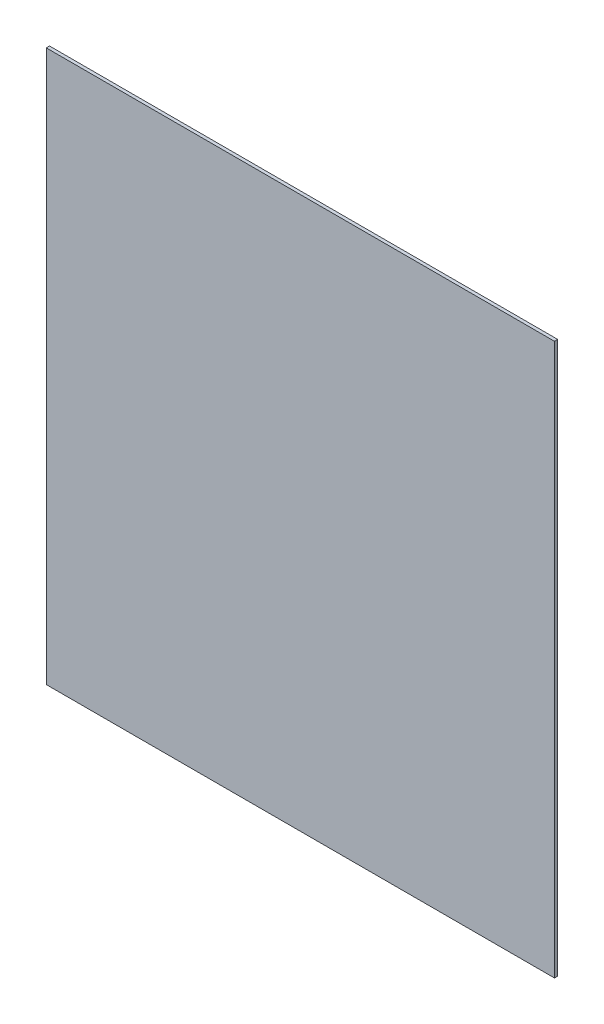
ISO-10303-21;
HEADER;
FILE_DESCRIPTION(('STEP AP214'),'2;1');
FILE_NAME('part.step','',(''),(''),'','','');
FILE_SCHEMA(('AUTOMOTIVE_DESIGN { 1 0 10303 214 1 1 1 1 }'));
ENDSEC;
DATA;
#1=APPLICATION_CONTEXT('core data for automotive mechanical design processes');
#2=APPLICATION_PROTOCOL_DEFINITION('international standard','automotive_design',2000,#1);
#3=PRODUCT_CONTEXT('',#1,'mechanical');
#4=PRODUCT('Part','Part','',(#3));
#5=PRODUCT_RELATED_PRODUCT_CATEGORY('part','',(#4));
#6=PRODUCT_DEFINITION_FORMATION('','',#4);
#7=PRODUCT_DEFINITION_CONTEXT('part definition',#1,'design');
#8=PRODUCT_DEFINITION('design','',#6,#7);
#9=PRODUCT_DEFINITION_SHAPE('','',#8);
#10=(LENGTH_UNIT() NAMED_UNIT(*) SI_UNIT(.MILLI.,.METRE.));
#11=(NAMED_UNIT(*) PLANE_ANGLE_UNIT() SI_UNIT($,.RADIAN.));
#12=(NAMED_UNIT(*) SI_UNIT($,.STERADIAN.) SOLID_ANGLE_UNIT());
#13=UNCERTAINTY_MEASURE_WITH_UNIT(LENGTH_MEASURE(1.E-05),#10,'distance_accuracy_value','');
#14=(GEOMETRIC_REPRESENTATION_CONTEXT(3) GLOBAL_UNCERTAINTY_ASSIGNED_CONTEXT((#13)) GLOBAL_UNIT_ASSIGNED_CONTEXT((#10,
#11,#12)) REPRESENTATION_CONTEXT('',''));
#15=CARTESIAN_POINT('',(0.,0.,0.));
#16=DIRECTION('',(0.,0.,1.));
#17=DIRECTION('',(1.,0.,0.));
#18=AXIS2_PLACEMENT_3D('',#15,#16,#17);
#19=CARTESIAN_POINT('',(-235.,255.,3.));
#20=DIRECTION('',(1.,0.,0.));
#21=DIRECTION('',(0.,1.,0.));
#22=AXIS2_PLACEMENT_3D('',#19,#20,#21);
#23=PLANE('',#22);
#24=DIRECTION('',(0.,-1.,0.));
#25=VECTOR('',#24,1.);
#26=CARTESIAN_POINT('',(-235.,255.,0.));
#27=LINE('',#26,#25);
#28=CARTESIAN_POINT('',(-235.,255.,0.));
#29=VERTEX_POINT('',#28);
#30=CARTESIAN_POINT('',(-235.,-255.,0.));
#31=VERTEX_POINT('',#30);
#32=EDGE_CURVE('E107',#29,#31,#27,.T.);
#33=ORIENTED_EDGE('',*,*,#32,.T.);
#34=DIRECTION('',(0.,0.,-1.));
#35=VECTOR('',#34,1.);
#36=CARTESIAN_POINT('',(-235.,-255.,3.));
#37=LINE('',#36,#35);
#38=CARTESIAN_POINT('',(-235.,-255.,3.));
#39=VERTEX_POINT('',#38);
#40=EDGE_CURVE('E11',#39,#31,#37,.T.);
#41=ORIENTED_EDGE('',*,*,#40,.F.);
#42=DIRECTION('',(0.,-1.,0.));
#43=VECTOR('',#42,1.);
#44=CARTESIAN_POINT('',(-235.,255.,3.));
#45=LINE('',#44,#43);
#46=CARTESIAN_POINT('',(-235.,255.,3.));
#47=VERTEX_POINT('',#46);
#48=EDGE_CURVE('E91',#47,#39,#45,.T.);
#49=ORIENTED_EDGE('',*,*,#48,.F.);
#50=DIRECTION('',(0.,0.,-1.));
#51=VECTOR('',#50,1.);
#52=CARTESIAN_POINT('',(-235.,255.,3.));
#53=LINE('',#52,#51);
#54=EDGE_CURVE('E103',#47,#29,#53,.T.);
#55=ORIENTED_EDGE('',*,*,#54,.T.);
#56=EDGE_LOOP('',(#33,#41,#49,#55));
#57=FACE_BOUND('',#56,.T.);
#58=ADVANCED_FACE('F39',(#57),#23,.F.);
#59=CARTESIAN_POINT('',(235.,-255.,3.));
#60=DIRECTION('',(0.,1.,0.));
#61=DIRECTION('',(-1.,0.,0.));
#62=AXIS2_PLACEMENT_3D('',#59,#60,#61);
#63=PLANE('',#62);
#64=DIRECTION('',(1.,0.,0.));
#65=VECTOR('',#64,1.);
#66=CARTESIAN_POINT('',(235.,-255.,0.));
#67=LINE('',#66,#65);
#68=CARTESIAN_POINT('',(235.,-255.,0.));
#69=VERTEX_POINT('',#68);
#70=EDGE_CURVE('E96',#31,#69,#67,.T.);
#71=ORIENTED_EDGE('',*,*,#70,.T.);
#72=DIRECTION('',(0.,0.,-1.));
#73=VECTOR('',#72,1.);
#74=CARTESIAN_POINT('',(235.,-255.,3.));
#75=LINE('',#74,#73);
#76=CARTESIAN_POINT('',(235.,-255.,3.));
#77=VERTEX_POINT('',#76);
#78=EDGE_CURVE('E48',#77,#69,#75,.T.);
#79=ORIENTED_EDGE('',*,*,#78,.F.);
#80=DIRECTION('',(1.,0.,0.));
#81=VECTOR('',#80,1.);
#82=CARTESIAN_POINT('',(235.,-255.,3.));
#83=LINE('',#82,#81);
#84=EDGE_CURVE('E86',#39,#77,#83,.T.);
#85=ORIENTED_EDGE('',*,*,#84,.F.);
#86=ORIENTED_EDGE('',*,*,#40,.T.);
#87=EDGE_LOOP('',(#71,#79,#85,#86));
#88=FACE_BOUND('',#87,.T.);
#89=ADVANCED_FACE('F95',(#88),#63,.F.);
#90=CARTESIAN_POINT('',(235.,255.,3.));
#91=DIRECTION('',(-1.,0.,0.));
#92=DIRECTION('',(0.,-1.,0.));
#93=AXIS2_PLACEMENT_3D('',#90,#91,#92);
#94=PLANE('',#93);
#95=DIRECTION('',(0.,1.,0.));
#96=VECTOR('',#95,1.);
#97=CARTESIAN_POINT('',(235.,255.,0.));
#98=LINE('',#97,#96);
#99=CARTESIAN_POINT('',(235.,255.,0.));
#100=VERTEX_POINT('',#99);
#101=EDGE_CURVE('E73',#69,#100,#98,.T.);
#102=ORIENTED_EDGE('',*,*,#101,.T.);
#103=DIRECTION('',(0.,0.,-1.));
#104=VECTOR('',#103,1.);
#105=CARTESIAN_POINT('',(235.,255.,3.));
#106=LINE('',#105,#104);
#107=CARTESIAN_POINT('',(235.,255.,3.));
#108=VERTEX_POINT('',#107);
#109=EDGE_CURVE('E98',#108,#100,#106,.T.);
#110=ORIENTED_EDGE('',*,*,#109,.F.);
#111=DIRECTION('',(0.,1.,0.));
#112=VECTOR('',#111,1.);
#113=CARTESIAN_POINT('',(235.,255.,3.));
#114=LINE('',#113,#112);
#115=EDGE_CURVE('E89',#77,#108,#114,.T.);
#116=ORIENTED_EDGE('',*,*,#115,.F.);
#117=ORIENTED_EDGE('',*,*,#78,.T.);
#118=EDGE_LOOP('',(#102,#110,#116,#117));
#119=FACE_BOUND('',#118,.T.);
#120=ADVANCED_FACE('F99',(#119),#94,.F.);
#121=CARTESIAN_POINT('',(235.,255.,3.));
#122=DIRECTION('',(0.,-1.,0.));
#123=DIRECTION('',(1.,0.,0.));
#124=AXIS2_PLACEMENT_3D('',#121,#122,#123);
#125=PLANE('',#124);
#126=DIRECTION('',(-1.,0.,0.));
#127=VECTOR('',#126,1.);
#128=CARTESIAN_POINT('',(235.,255.,0.));
#129=LINE('',#128,#127);
#130=EDGE_CURVE('E79',#100,#29,#129,.T.);
#131=ORIENTED_EDGE('',*,*,#130,.T.);
#132=ORIENTED_EDGE('',*,*,#54,.F.);
#133=DIRECTION('',(-1.,0.,0.));
#134=VECTOR('',#133,1.);
#135=CARTESIAN_POINT('',(235.,255.,3.));
#136=LINE('',#135,#134);
#137=EDGE_CURVE('E56',#108,#47,#136,.T.);
#138=ORIENTED_EDGE('',*,*,#137,.F.);
#139=ORIENTED_EDGE('',*,*,#109,.T.);
#140=EDGE_LOOP('',(#131,#132,#138,#139));
#141=FACE_BOUND('',#140,.T.);
#142=ADVANCED_FACE('F120',(#141),#125,.F.);
#143=CARTESIAN_POINT('',(0.,0.,3.));
#144=DIRECTION('',(0.,0.,-1.));
#145=DIRECTION('',(-1.,0.,0.));
#146=AXIS2_PLACEMENT_3D('',#143,#144,#145);
#147=PLANE('',#146);
#148=ORIENTED_EDGE('',*,*,#48,.T.);
#149=ORIENTED_EDGE('',*,*,#84,.T.);
#150=ORIENTED_EDGE('',*,*,#115,.T.);
#151=ORIENTED_EDGE('',*,*,#137,.T.);
#152=EDGE_LOOP('',(#148,#149,#150,#151));
#153=FACE_BOUND('',#152,.T.);
#154=ADVANCED_FACE('F87',(#153),#147,.F.);
#155=CARTESIAN_POINT('',(0.,0.,0.));
#156=DIRECTION('',(0.,0.,-1.));
#157=DIRECTION('',(-1.,0.,0.));
#158=AXIS2_PLACEMENT_3D('',#155,#156,#157);
#159=PLANE('',#158);
#160=ORIENTED_EDGE('',*,*,#32,.F.);
#161=ORIENTED_EDGE('',*,*,#130,.F.);
#162=ORIENTED_EDGE('',*,*,#101,.F.);
#163=ORIENTED_EDGE('',*,*,#70,.F.);
#164=EDGE_LOOP('',(#160,#161,#162,#163));
#165=FACE_BOUND('',#164,.T.);
#166=ADVANCED_FACE('F123',(#165),#159,.T.);
#167=CLOSED_SHELL('',(#58,#89,#120,#142,#154,#166));
#168=MANIFOLD_SOLID_BREP('B2',#167);
#169=ADVANCED_BREP_SHAPE_REPRESENTATION('',(#18,#168),#14);
#170=SHAPE_DEFINITION_REPRESENTATION(#9,#169);
ENDSEC;
END-ISO-10303-21;
